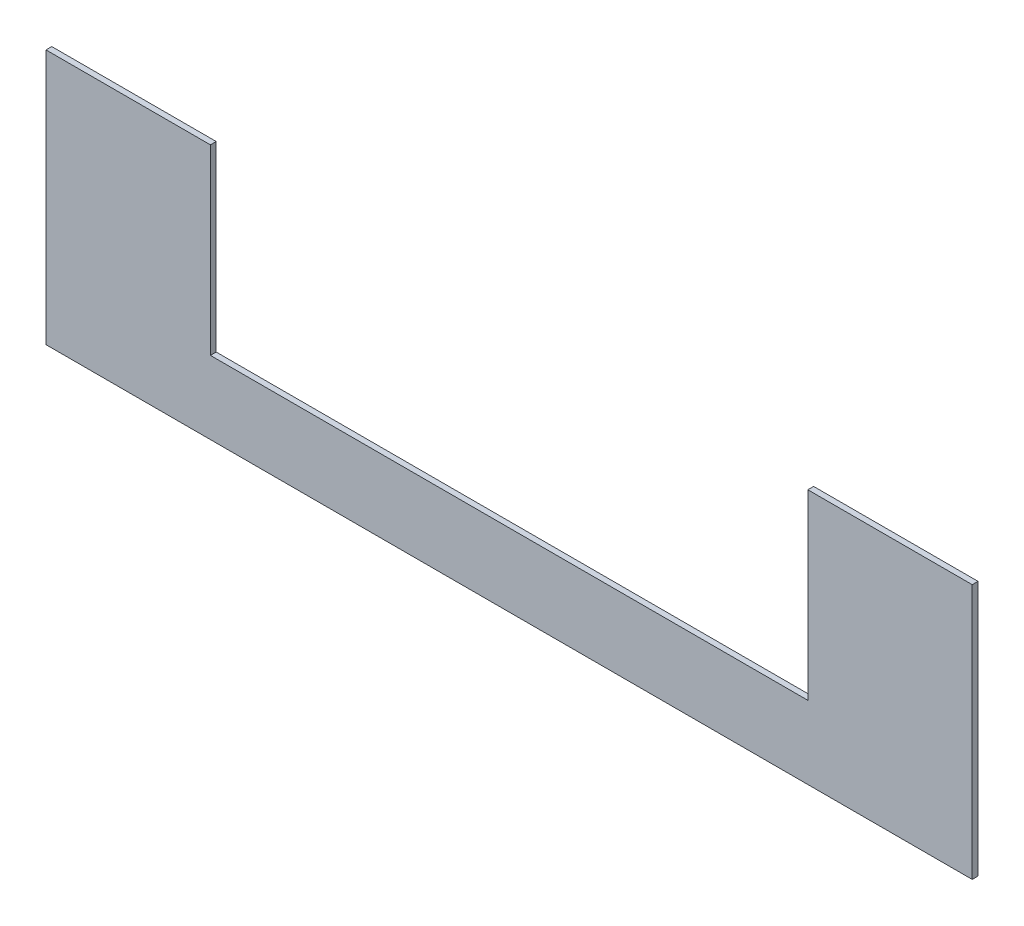
ISO-10303-21;
HEADER;
FILE_DESCRIPTION(('STEP AP214'),'2;1');
FILE_NAME('part.step','',(''),(''),'','','');
FILE_SCHEMA(('AUTOMOTIVE_DESIGN { 1 0 10303 214 1 1 1 1 }'));
ENDSEC;
DATA;
#1=APPLICATION_CONTEXT('core data for automotive mechanical design processes');
#2=APPLICATION_PROTOCOL_DEFINITION('international standard','automotive_design',2000,#1);
#3=PRODUCT_CONTEXT('',#1,'mechanical');
#4=PRODUCT('Part','Part','',(#3));
#5=PRODUCT_RELATED_PRODUCT_CATEGORY('part','',(#4));
#6=PRODUCT_DEFINITION_FORMATION('','',#4);
#7=PRODUCT_DEFINITION_CONTEXT('part definition',#1,'design');
#8=PRODUCT_DEFINITION('design','',#6,#7);
#9=PRODUCT_DEFINITION_SHAPE('','',#8);
#10=(LENGTH_UNIT() NAMED_UNIT(*) SI_UNIT(.MILLI.,.METRE.));
#11=(NAMED_UNIT(*) PLANE_ANGLE_UNIT() SI_UNIT($,.RADIAN.));
#12=(NAMED_UNIT(*) SI_UNIT($,.STERADIAN.) SOLID_ANGLE_UNIT());
#13=UNCERTAINTY_MEASURE_WITH_UNIT(LENGTH_MEASURE(1.E-05),#10,'distance_accuracy_value','');
#14=(GEOMETRIC_REPRESENTATION_CONTEXT(3) GLOBAL_UNCERTAINTY_ASSIGNED_CONTEXT((#13)) GLOBAL_UNIT_ASSIGNED_CONTEXT((#10,
#11,#12)) REPRESENTATION_CONTEXT('',''));
#15=CARTESIAN_POINT('',(0.,0.,0.));
#16=DIRECTION('',(0.,0.,1.));
#17=DIRECTION('',(1.,0.,0.));
#18=AXIS2_PLACEMENT_3D('',#15,#16,#17);
#19=CARTESIAN_POINT('',(0.397886764955409,0.0400699633658795,0.01));
#20=DIRECTION('',(0.,-1.,0.));
#21=DIRECTION('',(0.,0.,-1.));
#22=AXIS2_PLACEMENT_3D('',#19,#20,#21);
#23=PLANE('',#22);
#24=DIRECTION('',(-1.,0.,0.));
#25=VECTOR('',#24,1.);
#26=CARTESIAN_POINT('',(0.397886764955409,0.0400699633658795,0.));
#27=LINE('',#26,#25);
#28=CARTESIAN_POINT('',(0.681886764955409,0.0400699633658795,0.));
#29=VERTEX_POINT('',#28);
#30=CARTESIAN_POINT('',(0.397886764955409,0.0400699633658795,0.));
#31=VERTEX_POINT('',#30);
#32=EDGE_CURVE('E133',#29,#31,#27,.T.);
#33=ORIENTED_EDGE('',*,*,#32,.T.);
#34=DIRECTION('',(0.,0.,-1.));
#35=VECTOR('',#34,1.);
#36=CARTESIAN_POINT('',(0.397886764955409,0.0400699633658795,0.01));
#37=LINE('',#36,#35);
#38=CARTESIAN_POINT('',(0.397886764955409,0.0400699633658795,0.01));
#39=VERTEX_POINT('',#38);
#40=EDGE_CURVE('E11',#39,#31,#37,.T.);
#41=ORIENTED_EDGE('',*,*,#40,.F.);
#42=DIRECTION('',(-1.,0.,0.));
#43=VECTOR('',#42,1.);
#44=CARTESIAN_POINT('',(0.397886764955409,0.0400699633658795,0.01));
#45=LINE('',#44,#43);
#46=CARTESIAN_POINT('',(0.681886764955409,0.0400699633658795,0.01));
#47=VERTEX_POINT('',#46);
#48=EDGE_CURVE('E147',#47,#39,#45,.T.);
#49=ORIENTED_EDGE('',*,*,#48,.F.);
#50=DIRECTION('',(0.,0.,-1.));
#51=VECTOR('',#50,1.);
#52=CARTESIAN_POINT('',(0.681886764955409,0.0400699633658795,0.01));
#53=LINE('',#52,#51);
#54=EDGE_CURVE('E129',#47,#29,#53,.T.);
#55=ORIENTED_EDGE('',*,*,#54,.T.);
#56=EDGE_LOOP('',(#33,#41,#49,#55));
#57=FACE_BOUND('',#56,.T.);
#58=ADVANCED_FACE('F37',(#57),#23,.F.);
#59=CARTESIAN_POINT('',(0.397886764955409,-0.274930036634121,0.01));
#60=DIRECTION('',(1.,0.,0.));
#61=DIRECTION('',(0.,0.,-1.));
#62=AXIS2_PLACEMENT_3D('',#59,#60,#61);
#63=PLANE('',#62);
#64=DIRECTION('',(0.,-1.,0.));
#65=VECTOR('',#64,1.);
#66=CARTESIAN_POINT('',(0.397886764955409,-0.274930036634121,0.));
#67=LINE('',#66,#65);
#68=CARTESIAN_POINT('',(0.397886764955409,-0.274930036634121,0.));
#69=VERTEX_POINT('',#68);
#70=EDGE_CURVE('E136',#31,#69,#67,.T.);
#71=ORIENTED_EDGE('',*,*,#70,.T.);
#72=DIRECTION('',(0.,0.,-1.));
#73=VECTOR('',#72,1.);
#74=CARTESIAN_POINT('',(0.397886764955409,-0.274930036634121,0.01));
#75=LINE('',#74,#73);
#76=CARTESIAN_POINT('',(0.397886764955409,-0.274930036634121,0.01));
#77=VERTEX_POINT('',#76);
#78=EDGE_CURVE('E45',#77,#69,#75,.T.);
#79=ORIENTED_EDGE('',*,*,#78,.F.);
#80=DIRECTION('',(0.,-1.,0.));
#81=VECTOR('',#80,1.);
#82=CARTESIAN_POINT('',(0.397886764955409,-0.274930036634121,0.01));
#83=LINE('',#82,#81);
#84=EDGE_CURVE('E96',#39,#77,#83,.T.);
#85=ORIENTED_EDGE('',*,*,#84,.F.);
#86=ORIENTED_EDGE('',*,*,#40,.T.);
#87=EDGE_LOOP('',(#71,#79,#85,#86));
#88=FACE_BOUND('',#87,.T.);
#89=ADVANCED_FACE('F182',(#88),#63,.F.);
#90=CARTESIAN_POINT('',(-0.634113235044591,-0.274930036634121,0.01));
#91=DIRECTION('',(0.,-1.,0.));
#92=DIRECTION('',(0.,0.,-1.));
#93=AXIS2_PLACEMENT_3D('',#90,#91,#92);
#94=PLANE('',#93);
#95=DIRECTION('',(-1.,0.,0.));
#96=VECTOR('',#95,1.);
#97=CARTESIAN_POINT('',(-0.634113235044591,-0.274930036634121,0.));
#98=LINE('',#97,#96);
#99=CARTESIAN_POINT('',(-0.634113235044591,-0.274930036634121,0.));
#100=VERTEX_POINT('',#99);
#101=EDGE_CURVE('E138',#69,#100,#98,.T.);
#102=ORIENTED_EDGE('',*,*,#101,.T.);
#103=DIRECTION('',(0.,0.,-1.));
#104=VECTOR('',#103,1.);
#105=CARTESIAN_POINT('',(-0.634113235044591,-0.274930036634121,0.01));
#106=LINE('',#105,#104);
#107=CARTESIAN_POINT('',(-0.634113235044591,-0.274930036634121,0.01));
#108=VERTEX_POINT('',#107);
#109=EDGE_CURVE('E154',#108,#100,#106,.T.);
#110=ORIENTED_EDGE('',*,*,#109,.F.);
#111=DIRECTION('',(-1.,0.,0.));
#112=VECTOR('',#111,1.);
#113=CARTESIAN_POINT('',(-0.634113235044591,-0.274930036634121,0.01));
#114=LINE('',#113,#112);
#115=EDGE_CURVE('E162',#77,#108,#114,.T.);
#116=ORIENTED_EDGE('',*,*,#115,.F.);
#117=ORIENTED_EDGE('',*,*,#78,.T.);
#118=EDGE_LOOP('',(#102,#110,#116,#117));
#119=FACE_BOUND('',#118,.T.);
#120=ADVANCED_FACE('F160',(#119),#94,.F.);
#121=CARTESIAN_POINT('',(-0.634113235044592,0.0400699633658795,0.01));
#122=DIRECTION('',(-1.,0.,0.));
#123=DIRECTION('',(0.,-1.,0.));
#124=AXIS2_PLACEMENT_3D('',#121,#122,#123);
#125=PLANE('',#124);
#126=DIRECTION('',(0.,1.,0.));
#127=VECTOR('',#126,1.);
#128=CARTESIAN_POINT('',(-0.634113235044592,0.0400699633658795,0.));
#129=LINE('',#128,#127);
#130=CARTESIAN_POINT('',(-0.634113235044592,0.0400699633658795,0.));
#131=VERTEX_POINT('',#130);
#132=EDGE_CURVE('E140',#100,#131,#129,.T.);
#133=ORIENTED_EDGE('',*,*,#132,.T.);
#134=DIRECTION('',(0.,0.,-1.));
#135=VECTOR('',#134,1.);
#136=CARTESIAN_POINT('',(-0.634113235044592,0.0400699633658795,0.01));
#137=LINE('',#136,#135);
#138=CARTESIAN_POINT('',(-0.634113235044592,0.0400699633658795,0.01));
#139=VERTEX_POINT('',#138);
#140=EDGE_CURVE('E151',#139,#131,#137,.T.);
#141=ORIENTED_EDGE('',*,*,#140,.F.);
#142=DIRECTION('',(0.,1.,0.));
#143=VECTOR('',#142,1.);
#144=CARTESIAN_POINT('',(-0.634113235044592,0.0400699633658795,0.01));
#145=LINE('',#144,#143);
#146=EDGE_CURVE('E174',#108,#139,#145,.T.);
#147=ORIENTED_EDGE('',*,*,#146,.F.);
#148=ORIENTED_EDGE('',*,*,#109,.T.);
#149=EDGE_LOOP('',(#133,#141,#147,#148));
#150=FACE_BOUND('',#149,.T.);
#151=ADVANCED_FACE('F170',(#150),#125,.F.);
#152=CARTESIAN_POINT('',(-0.918113235044591,0.0400699633658795,0.01));
#153=DIRECTION('',(0.,-1.,0.));
#154=DIRECTION('',(0.,0.,-1.));
#155=AXIS2_PLACEMENT_3D('',#152,#153,#154);
#156=PLANE('',#155);
#157=DIRECTION('',(-1.,0.,0.));
#158=VECTOR('',#157,1.);
#159=CARTESIAN_POINT('',(-0.918113235044591,0.0400699633658795,0.));
#160=LINE('',#159,#158);
#161=CARTESIAN_POINT('',(-0.918113235044591,0.0400699633658795,0.));
#162=VERTEX_POINT('',#161);
#163=EDGE_CURVE('E142',#131,#162,#160,.T.);
#164=ORIENTED_EDGE('',*,*,#163,.T.);
#165=DIRECTION('',(0.,0.,-1.));
#166=VECTOR('',#165,1.);
#167=CARTESIAN_POINT('',(-0.918113235044591,0.0400699633658795,0.01));
#168=LINE('',#167,#166);
#169=CARTESIAN_POINT('',(-0.918113235044591,0.0400699633658795,0.01));
#170=VERTEX_POINT('',#169);
#171=EDGE_CURVE('E124',#170,#162,#168,.T.);
#172=ORIENTED_EDGE('',*,*,#171,.F.);
#173=DIRECTION('',(-1.,0.,0.));
#174=VECTOR('',#173,1.);
#175=CARTESIAN_POINT('',(-0.918113235044591,0.0400699633658795,0.01));
#176=LINE('',#175,#174);
#177=EDGE_CURVE('E115',#139,#170,#176,.T.);
#178=ORIENTED_EDGE('',*,*,#177,.F.);
#179=ORIENTED_EDGE('',*,*,#140,.T.);
#180=EDGE_LOOP('',(#164,#172,#178,#179));
#181=FACE_BOUND('',#180,.T.);
#182=ADVANCED_FACE('F173',(#181),#156,.F.);
#183=CARTESIAN_POINT('',(-0.918113235044591,-0.40093003663412,0.01));
#184=DIRECTION('',(1.,0.,0.));
#185=DIRECTION('',(0.,1.,0.));
#186=AXIS2_PLACEMENT_3D('',#183,#184,#185);
#187=PLANE('',#186);
#188=DIRECTION('',(0.,-1.,0.));
#189=VECTOR('',#188,1.);
#190=CARTESIAN_POINT('',(-0.918113235044591,-0.40093003663412,0.));
#191=LINE('',#190,#189);
#192=CARTESIAN_POINT('',(-0.918113235044591,-0.40093003663412,0.));
#193=VERTEX_POINT('',#192);
#194=EDGE_CURVE('E123',#162,#193,#191,.T.);
#195=ORIENTED_EDGE('',*,*,#194,.T.);
#196=DIRECTION('',(0.,0.,-1.));
#197=VECTOR('',#196,1.);
#198=CARTESIAN_POINT('',(-0.918113235044591,-0.40093003663412,0.01));
#199=LINE('',#198,#197);
#200=CARTESIAN_POINT('',(-0.918113235044591,-0.40093003663412,0.01));
#201=VERTEX_POINT('',#200);
#202=EDGE_CURVE('E120',#201,#193,#199,.T.);
#203=ORIENTED_EDGE('',*,*,#202,.F.);
#204=DIRECTION('',(0.,-1.,0.));
#205=VECTOR('',#204,1.);
#206=CARTESIAN_POINT('',(-0.918113235044591,-0.40093003663412,0.01));
#207=LINE('',#206,#205);
#208=EDGE_CURVE('E109',#170,#201,#207,.T.);
#209=ORIENTED_EDGE('',*,*,#208,.F.);
#210=ORIENTED_EDGE('',*,*,#171,.T.);
#211=EDGE_LOOP('',(#195,#203,#209,#210));
#212=FACE_BOUND('',#211,.T.);
#213=ADVANCED_FACE('F121',(#212),#187,.F.);
#214=CARTESIAN_POINT('',(0.681886764955409,-0.40093003663412,0.01));
#215=DIRECTION('',(0.,1.,0.));
#216=DIRECTION('',(-1.,0.,0.));
#217=AXIS2_PLACEMENT_3D('',#214,#215,#216);
#218=PLANE('',#217);
#219=DIRECTION('',(1.,0.,0.));
#220=VECTOR('',#219,1.);
#221=CARTESIAN_POINT('',(0.681886764955409,-0.40093003663412,0.));
#222=LINE('',#221,#220);
#223=CARTESIAN_POINT('',(0.681886764955409,-0.40093003663412,0.));
#224=VERTEX_POINT('',#223);
#225=EDGE_CURVE('E82',#193,#224,#222,.T.);
#226=ORIENTED_EDGE('',*,*,#225,.T.);
#227=DIRECTION('',(0.,0.,-1.));
#228=VECTOR('',#227,1.);
#229=CARTESIAN_POINT('',(0.681886764955409,-0.40093003663412,0.01));
#230=LINE('',#229,#228);
#231=CARTESIAN_POINT('',(0.681886764955409,-0.40093003663412,0.01));
#232=VERTEX_POINT('',#231);
#233=EDGE_CURVE('E125',#232,#224,#230,.T.);
#234=ORIENTED_EDGE('',*,*,#233,.F.);
#235=DIRECTION('',(1.,0.,0.));
#236=VECTOR('',#235,1.);
#237=CARTESIAN_POINT('',(0.681886764955409,-0.40093003663412,0.01));
#238=LINE('',#237,#236);
#239=EDGE_CURVE('E113',#201,#232,#238,.T.);
#240=ORIENTED_EDGE('',*,*,#239,.F.);
#241=ORIENTED_EDGE('',*,*,#202,.T.);
#242=EDGE_LOOP('',(#226,#234,#240,#241));
#243=FACE_BOUND('',#242,.T.);
#244=ADVANCED_FACE('F127',(#243),#218,.F.);
#245=CARTESIAN_POINT('',(0.681886764955409,0.0400699633658795,0.01));
#246=DIRECTION('',(-1.,0.,0.));
#247=DIRECTION('',(0.,-1.,0.));
#248=AXIS2_PLACEMENT_3D('',#245,#246,#247);
#249=PLANE('',#248);
#250=DIRECTION('',(0.,1.,0.));
#251=VECTOR('',#250,1.);
#252=CARTESIAN_POINT('',(0.681886764955409,0.0400699633658795,0.));
#253=LINE('',#252,#251);
#254=EDGE_CURVE('E88',#224,#29,#253,.T.);
#255=ORIENTED_EDGE('',*,*,#254,.T.);
#256=ORIENTED_EDGE('',*,*,#54,.F.);
#257=DIRECTION('',(0.,1.,0.));
#258=VECTOR('',#257,1.);
#259=CARTESIAN_POINT('',(0.681886764955409,0.0400699633658795,0.01));
#260=LINE('',#259,#258);
#261=EDGE_CURVE('E53',#232,#47,#260,.T.);
#262=ORIENTED_EDGE('',*,*,#261,.F.);
#263=ORIENTED_EDGE('',*,*,#233,.T.);
#264=EDGE_LOOP('',(#255,#256,#262,#263));
#265=FACE_BOUND('',#264,.T.);
#266=ADVANCED_FACE('F198',(#265),#249,.F.);
#267=CARTESIAN_POINT('',(0.,0.,0.01));
#268=DIRECTION('',(0.,0.,-1.));
#269=DIRECTION('',(-1.,0.,0.));
#270=AXIS2_PLACEMENT_3D('',#267,#268,#269);
#271=PLANE('',#270);
#272=ORIENTED_EDGE('',*,*,#48,.T.);
#273=ORIENTED_EDGE('',*,*,#84,.T.);
#274=ORIENTED_EDGE('',*,*,#115,.T.);
#275=ORIENTED_EDGE('',*,*,#146,.T.);
#276=ORIENTED_EDGE('',*,*,#177,.T.);
#277=ORIENTED_EDGE('',*,*,#208,.T.);
#278=ORIENTED_EDGE('',*,*,#239,.T.);
#279=ORIENTED_EDGE('',*,*,#261,.T.);
#280=EDGE_LOOP('',(#272,#273,#274,#275,#276,#277,#278,#279));
#281=FACE_BOUND('',#280,.T.);
#282=ADVANCED_FACE('F111',(#281),#271,.F.);
#283=CARTESIAN_POINT('',(0.,0.,0.));
#284=DIRECTION('',(0.,0.,-1.));
#285=DIRECTION('',(-1.,0.,0.));
#286=AXIS2_PLACEMENT_3D('',#283,#284,#285);
#287=PLANE('',#286);
#288=ORIENTED_EDGE('',*,*,#32,.F.);
#289=ORIENTED_EDGE('',*,*,#254,.F.);
#290=ORIENTED_EDGE('',*,*,#225,.F.);
#291=ORIENTED_EDGE('',*,*,#194,.F.);
#292=ORIENTED_EDGE('',*,*,#163,.F.);
#293=ORIENTED_EDGE('',*,*,#132,.F.);
#294=ORIENTED_EDGE('',*,*,#101,.F.);
#295=ORIENTED_EDGE('',*,*,#70,.F.);
#296=EDGE_LOOP('',(#288,#289,#290,#291,#292,#293,#294,#295));
#297=FACE_BOUND('',#296,.T.);
#298=ADVANCED_FACE('F166',(#297),#287,.T.);
#299=CLOSED_SHELL('',(#58,#89,#120,#151,#182,#213,#244,#266,#282,#298));
#300=MANIFOLD_SOLID_BREP('B2',#299);
#301=ADVANCED_BREP_SHAPE_REPRESENTATION('',(#18,#300),#14);
#302=SHAPE_DEFINITION_REPRESENTATION(#9,#301);
ENDSEC;
END-ISO-10303-21;
